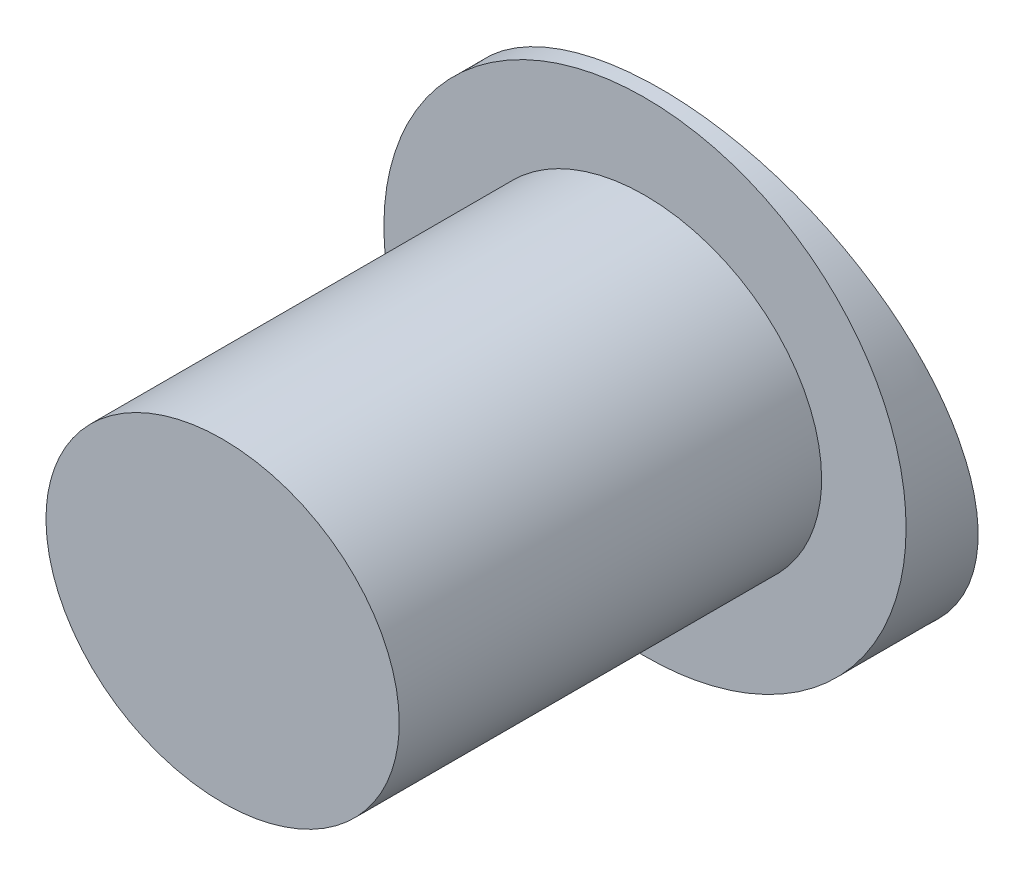
ISO-10303-21;
HEADER;
FILE_DESCRIPTION(('STEP AP214'),'2;1');
FILE_NAME('part.step','',(''),(''),'','','');
FILE_SCHEMA(('AUTOMOTIVE_DESIGN { 1 0 10303 214 1 1 1 1 }'));
ENDSEC;
DATA;
#1=APPLICATION_CONTEXT('core data for automotive mechanical design processes');
#2=APPLICATION_PROTOCOL_DEFINITION('international standard','automotive_design',2000,#1);
#3=PRODUCT_CONTEXT('',#1,'mechanical');
#4=PRODUCT('Part','Part','',(#3));
#5=PRODUCT_RELATED_PRODUCT_CATEGORY('part','',(#4));
#6=PRODUCT_DEFINITION_FORMATION('','',#4);
#7=PRODUCT_DEFINITION_CONTEXT('part definition',#1,'design');
#8=PRODUCT_DEFINITION('design','',#6,#7);
#9=PRODUCT_DEFINITION_SHAPE('','',#8);
#10=(LENGTH_UNIT() NAMED_UNIT(*) SI_UNIT(.MILLI.,.METRE.));
#11=(NAMED_UNIT(*) PLANE_ANGLE_UNIT() SI_UNIT($,.RADIAN.));
#12=(NAMED_UNIT(*) SI_UNIT($,.STERADIAN.) SOLID_ANGLE_UNIT());
#13=UNCERTAINTY_MEASURE_WITH_UNIT(LENGTH_MEASURE(1.E-05),#10,'distance_accuracy_value','');
#14=(GEOMETRIC_REPRESENTATION_CONTEXT(3) GLOBAL_UNCERTAINTY_ASSIGNED_CONTEXT((#13)) GLOBAL_UNIT_ASSIGNED_CONTEXT((#10,
#11,#12)) REPRESENTATION_CONTEXT('',''));
#15=CARTESIAN_POINT('',(0.,0.,0.));
#16=DIRECTION('',(0.,0.,1.));
#17=DIRECTION('',(1.,0.,0.));
#18=AXIS2_PLACEMENT_3D('',#15,#16,#17);
#19=CARTESIAN_POINT('',(-6.8,0.,-14.));
#20=CARTESIAN_POINT('',(-6.8,0.433288327017882,-14.));
#21=CARTESIAN_POINT('',(-6.75241623918822,0.858366789318417,-14.));
#22=CARTESIAN_POINT('',(-6.56669350048157,1.6928997685016,-14.));
#23=CARTESIAN_POINT('',(-6.42593496589087,2.10646432470144,-14.));
#24=CARTESIAN_POINT('',(-6.06502077946472,2.88351596537641,-14.));
#25=CARTESIAN_POINT('',(-5.84513782173978,3.25023430353571,-14.));
#26=CARTESIAN_POINT('',(-5.4571812493302,3.76815739814183,-14.));
#27=CARTESIAN_POINT('',(-5.31849415232598,3.93466075191506,-14.));
#28=CARTESIAN_POINT('',(-5.0278802522335,4.25012524863653,-14.));
#29=CARTESIAN_POINT('',(-4.87530875171523,4.3999724438203,-14.));
#30=CARTESIAN_POINT('',(-4.55609558279421,4.68439486073192,-14.));
#31=CARTESIAN_POINT('',(-4.38945272316332,4.81896878948268,-14.));
#32=CARTESIAN_POINT('',(-4.04214202784557,5.07289372542383,-14.));
#33=CARTESIAN_POINT('',(-3.86090614551277,5.19247257704731,-14.));
#34=CARTESIAN_POINT('',(-3.30684778903162,5.52179462881207,-14.));
#35=CARTESIAN_POINT('',(-2.92075333708403,5.70488509614901,-14.));
#36=CARTESIAN_POINT('',(-2.11655938182206,6.00128900909616,-14.));
#37=CARTESIAN_POINT('',(-1.69610545760056,6.11431758800332,-14.));
#38=CARTESIAN_POINT('',(-0.85378878137073,6.26286530020241,-14.));
#39=CARTESIAN_POINT('',(-0.428447412867185,6.3000640003056,-14.));
#40=CARTESIAN_POINT('',(0.215870939078355,6.29996787697511,-14.));
#41=CARTESIAN_POINT('',(0.432632938983341,6.29042124328013,-14.));
#42=CARTESIAN_POINT('',(0.860837611376539,6.25262645739517,-14.));
#43=CARTESIAN_POINT('',(1.07288822927773,6.2244614538175,-14.));
#44=CARTESIAN_POINT('',(1.70298577834547,6.11261915171547,-14.));
#45=CARTESIAN_POINT('',(2.11503534731815,6.00185177080731,-14.));
#46=CARTESIAN_POINT('',(2.72048972370927,5.778696268597,-14.));
#47=CARTESIAN_POINT('',(2.92051732246431,5.6944630532301,-14.));
#48=CARTESIAN_POINT('',(3.30781838286319,5.50998341043302,-14.));
#49=CARTESIAN_POINT('',(3.49615939508585,5.40939521227842,-14.));
#50=CARTESIAN_POINT('',(4.04528311200834,5.08263145367567,-14.));
#51=CARTESIAN_POINT('',(4.39033491286368,4.83172153644008,-14.));
#52=CARTESIAN_POINT('',(4.87370990843407,4.40157831863281,-14.));
#53=CARTESIAN_POINT('',(5.02819913131833,4.24978318078785,-14.));
#54=CARTESIAN_POINT('',(5.31828795393822,3.93488050207727,-14.));
#55=CARTESIAN_POINT('',(5.45475436297693,3.77102456416908,-14.));
#56=CARTESIAN_POINT('',(5.71043152424103,3.43042908781699,-14.));
#57=CARTESIAN_POINT('',(5.82964407047417,3.25369088883413,-14.));
#58=CARTESIAN_POINT('',(6.05019793151896,2.8868712835245,-14.));
#59=CARTESIAN_POINT('',(6.15201457180541,2.69574531034534,-14.));
#60=CARTESIAN_POINT('',(6.42542698783263,2.10848454295557,-14.));
#61=CARTESIAN_POINT('',(6.56323947653883,1.70430351885267,-14.));
#62=CARTESIAN_POINT('',(6.75054699096156,0.870766929490032,-14.));
#63=CARTESIAN_POINT('',(6.79942714302823,0.436118566493674,-14.));
#64=CARTESIAN_POINT('',(6.8005625739134,-0.420600760281517,-14.));
#65=CARTESIAN_POINT('',(6.75460282525542,-0.84551306791546,-14.));
#66=CARTESIAN_POINT('',(6.61492546890545,-1.4776403640284,-14.));
#67=CARTESIAN_POINT('',(6.55649149478053,-1.6866872355737,-14.));
#68=CARTESIAN_POINT('',(6.41890410892055,-2.09309330337095,-14.));
#69=CARTESIAN_POINT('',(6.33950068365258,-2.29168874715316,-14.));
#70=CARTESIAN_POINT('',(6.15998500574276,-2.67988621383843,-14.));
#71=CARTESIAN_POINT('',(6.05987169187281,-2.86948777587181,-14.));
#72=CARTESIAN_POINT('',(5.83880643557088,-3.23964110905378,-14.));
#73=CARTESIAN_POINT('',(5.71776697213712,-3.42002033458585,-14.));
#74=CARTESIAN_POINT('',(5.33192858517686,-3.93587106894263,-14.));
#75=CARTESIAN_POINT('',(5.04223304418031,-4.2505798636767,-14.));
#76=CARTESIAN_POINT('',(4.56082110802009,-4.68050641553838,-14.));
#77=CARTESIAN_POINT('',(4.39180697761757,-4.81712595576104,-14.));
#78=CARTESIAN_POINT('',(4.04471446373682,-5.07113285599945,-14.));
#79=CARTESIAN_POINT('',(3.86600227698754,-5.18918260619546,-14.));
#80=CARTESIAN_POINT('',(3.31495355542297,-5.51748578016713,-14.));
#81=CARTESIAN_POINT('',(2.92615744732289,-5.70272731244022,-14.));
#82=CARTESIAN_POINT('',(2.11596657067965,-6.001672496799,-14.));
#83=CARTESIAN_POINT('',(1.70277845589563,-6.11271604455791,-14.));
#84=CARTESIAN_POINT('',(1.07149752877712,-6.22467814975525,-14.));
#85=CARTESIAN_POINT('',(0.85914021123725,-6.25283239185984,-14.));
#86=CARTESIAN_POINT('',(0.430510973620271,-6.29055191659552,-14.));
#87=CARTESIAN_POINT('',(0.213656009927172,-6.30003370890853,-14.));
#88=CARTESIAN_POINT('',(-0.430786666576888,-6.29993230882312,-14.));
#89=CARTESIAN_POINT('',(-0.855993728490451,-6.2625888695087,-14.));
#90=CARTESIAN_POINT('',(-1.69763442786098,-6.11393501959793,-14.));
#91=CARTESIAN_POINT('',(-2.11819205564536,-6.00080011354235,-14.));
#92=CARTESIAN_POINT('',(-2.92243337786917,-5.70415254981059,-14.));
#93=CARTESIAN_POINT('',(-3.30741860912684,-5.52133596513065,-14.));
#94=CARTESIAN_POINT('',(-4.04218653979238,-5.08484177856928,-14.));
#95=CARTESIAN_POINT('',(-4.39508149266217,-4.82773210424261,-14.));
#96=CARTESIAN_POINT('',(-5.03412848528504,-4.25858995690001,-14.));
#97=CARTESIAN_POINT('',(-5.3233109425649,-3.9457601736987,-14.));
#98=CARTESIAN_POINT('',(-5.70934689492623,-3.43205404374183,-14.));
#99=CARTESIAN_POINT('',(-5.83064218602389,-3.25227206968252,-14.));
#100=CARTESIAN_POINT('',(-6.05289313591445,-2.88214342621327,-14.));
#101=CARTESIAN_POINT('',(-6.15342465819993,-2.69278869910542,-14.));
#102=CARTESIAN_POINT('',(-6.42370337627923,-2.11204202899084,-14.));
#103=CARTESIAN_POINT('',(-6.56247831461694,-1.70810674696064,-14.));
#104=CARTESIAN_POINT('',(-6.7518553552028,-0.864527394888873,-14.));
#105=CARTESIAN_POINT('',(-6.8,-0.43328832701788,-14.));
#106=CARTESIAN_POINT('',(-6.8,0.,-14.));
#107=B_SPLINE_CURVE_WITH_KNOTS('',3,(#19,#20,#21,#22,#23,#24,#25,#26,#27,#28,#29,#30,#31,#32,
#33,#34,#35,#36,#37,#38,#39,#40,#41,#42,#43,#44,#45,#46,#47,#48,#49,#50,#51,#52,#53,#54,#55,#56,
#57,#58,#59,#60,#61,#62,#63,#64,#65,#66,#67,#68,#69,#70,#71,#72,#73,#74,#75,#76,#77,#78,#79,#80,
#81,#82,#83,#84,#85,#86,#87,#88,#89,#90,#91,#92,#93,#94,#95,#96,#97,#98,#99,#100,#101,#102,#103,
#104,#105,#106),.UNSPECIFIED.,.T.,.F.,(4,2,2,2,2,2,2,2,2,2,2,2,2,2,2,2,2,2,2,2,2,2,2,2,2,2,2,2,
2,2,2,2,2,2,2,2,2,2,2,2,2,2,2,4),(0.,0.0312500000000001,0.0625000000000002,0.0937500000000004,
0.109375,0.125000000000001,0.140625000000001,0.156250000000001,0.187500000000001,
0.218750000000001,0.250000000000001,0.265625000000001,0.281250000000001,0.312500000000001,
0.328125000000001,0.343750000000001,0.375000000000001,0.390625000000001,0.406250000000001,
0.421875000000001,0.437500000000001,0.468750000000001,0.500000000000001,0.531250000000001,
0.546875000000001,0.562500000000001,0.578125000000001,0.593750000000001,0.625000000000001,
0.640625000000001,0.656250000000001,0.687500000000001,0.718750000000001,0.734375000000001,
0.750000000000001,0.781250000000001,0.812500000000001,0.84375,0.875,0.90625,0.921875,0.9375,
0.96875,1.),.UNSPECIFIED.);
#108=DIRECTION('',(0.,0.,1.));
#109=VECTOR('',#108,1.);
#110=SURFACE_OF_LINEAR_EXTRUSION('',#107,#109);
#111=CARTESIAN_POINT('',(-6.8,0.,-11.));
#112=CARTESIAN_POINT('',(-6.8,0.433288327017882,-11.));
#113=CARTESIAN_POINT('',(-6.75241623918822,0.858366789318417,-11.));
#114=CARTESIAN_POINT('',(-6.56669350048157,1.6928997685016,-11.));
#115=CARTESIAN_POINT('',(-6.42593496589087,2.10646432470144,-11.));
#116=CARTESIAN_POINT('',(-6.06502077946472,2.88351596537641,-11.));
#117=CARTESIAN_POINT('',(-5.84513782173978,3.25023430353571,-11.));
#118=CARTESIAN_POINT('',(-5.4571812493302,3.76815739814183,-11.));
#119=CARTESIAN_POINT('',(-5.31849415232598,3.93466075191506,-11.));
#120=CARTESIAN_POINT('',(-5.0278802522335,4.25012524863653,-11.));
#121=CARTESIAN_POINT('',(-4.87530875171523,4.3999724438203,-11.));
#122=CARTESIAN_POINT('',(-4.55609558279421,4.68439486073192,-11.));
#123=CARTESIAN_POINT('',(-4.38945272316332,4.81896878948268,-11.));
#124=CARTESIAN_POINT('',(-4.04214202784557,5.07289372542383,-11.));
#125=CARTESIAN_POINT('',(-3.86090614551277,5.19247257704731,-11.));
#126=CARTESIAN_POINT('',(-3.30684778903162,5.52179462881207,-11.));
#127=CARTESIAN_POINT('',(-2.92075333708403,5.70488509614901,-11.));
#128=CARTESIAN_POINT('',(-2.11655938182206,6.00128900909616,-11.));
#129=CARTESIAN_POINT('',(-1.69610545760056,6.11431758800332,-11.));
#130=CARTESIAN_POINT('',(-0.85378878137073,6.26286530020241,-11.));
#131=CARTESIAN_POINT('',(-0.428447412867185,6.3000640003056,-11.));
#132=CARTESIAN_POINT('',(0.215870939078355,6.29996787697511,-11.));
#133=CARTESIAN_POINT('',(0.432632938983341,6.29042124328013,-11.));
#134=CARTESIAN_POINT('',(0.860837611376539,6.25262645739517,-11.));
#135=CARTESIAN_POINT('',(1.07288822927773,6.2244614538175,-11.));
#136=CARTESIAN_POINT('',(1.70298577834547,6.11261915171547,-11.));
#137=CARTESIAN_POINT('',(2.11503534731815,6.00185177080731,-11.));
#138=CARTESIAN_POINT('',(2.72048972370927,5.778696268597,-11.));
#139=CARTESIAN_POINT('',(2.92051732246431,5.6944630532301,-11.));
#140=CARTESIAN_POINT('',(3.30781838286319,5.50998341043302,-11.));
#141=CARTESIAN_POINT('',(3.49615939508585,5.40939521227842,-11.));
#142=CARTESIAN_POINT('',(4.04528311200834,5.08263145367567,-11.));
#143=CARTESIAN_POINT('',(4.39033491286368,4.83172153644008,-11.));
#144=CARTESIAN_POINT('',(4.87370990843407,4.40157831863281,-11.));
#145=CARTESIAN_POINT('',(5.02819913131833,4.24978318078785,-11.));
#146=CARTESIAN_POINT('',(5.31828795393822,3.93488050207727,-11.));
#147=CARTESIAN_POINT('',(5.45475436297693,3.77102456416908,-11.));
#148=CARTESIAN_POINT('',(5.71043152424103,3.43042908781699,-11.));
#149=CARTESIAN_POINT('',(5.82964407047417,3.25369088883413,-11.));
#150=CARTESIAN_POINT('',(6.05019793151896,2.8868712835245,-11.));
#151=CARTESIAN_POINT('',(6.15201457180541,2.69574531034534,-11.));
#152=CARTESIAN_POINT('',(6.42542698783263,2.10848454295557,-11.));
#153=CARTESIAN_POINT('',(6.56323947653883,1.70430351885267,-11.));
#154=CARTESIAN_POINT('',(6.75054699096156,0.870766929490032,-11.));
#155=CARTESIAN_POINT('',(6.79942714302823,0.436118566493674,-11.));
#156=CARTESIAN_POINT('',(6.8005625739134,-0.420600760281517,-11.));
#157=CARTESIAN_POINT('',(6.75460282525542,-0.84551306791546,-11.));
#158=CARTESIAN_POINT('',(6.61492546890545,-1.4776403640284,-11.));
#159=CARTESIAN_POINT('',(6.55649149478053,-1.6866872355737,-11.));
#160=CARTESIAN_POINT('',(6.41890410892055,-2.09309330337095,-11.));
#161=CARTESIAN_POINT('',(6.33950068365258,-2.29168874715316,-11.));
#162=CARTESIAN_POINT('',(6.15998500574276,-2.67988621383843,-11.));
#163=CARTESIAN_POINT('',(6.05987169187281,-2.86948777587181,-11.));
#164=CARTESIAN_POINT('',(5.83880643557088,-3.23964110905378,-11.));
#165=CARTESIAN_POINT('',(5.71776697213712,-3.42002033458585,-11.));
#166=CARTESIAN_POINT('',(5.33192858517686,-3.93587106894263,-11.));
#167=CARTESIAN_POINT('',(5.04223304418031,-4.2505798636767,-11.));
#168=CARTESIAN_POINT('',(4.56082110802009,-4.68050641553838,-11.));
#169=CARTESIAN_POINT('',(4.39180697761757,-4.81712595576104,-11.));
#170=CARTESIAN_POINT('',(4.04471446373682,-5.07113285599945,-11.));
#171=CARTESIAN_POINT('',(3.86600227698754,-5.18918260619546,-11.));
#172=CARTESIAN_POINT('',(3.31495355542297,-5.51748578016713,-11.));
#173=CARTESIAN_POINT('',(2.92615744732289,-5.70272731244022,-11.));
#174=CARTESIAN_POINT('',(2.11596657067965,-6.001672496799,-11.));
#175=CARTESIAN_POINT('',(1.70277845589563,-6.11271604455791,-11.));
#176=CARTESIAN_POINT('',(1.07149752877712,-6.22467814975525,-11.));
#177=CARTESIAN_POINT('',(0.85914021123725,-6.25283239185984,-11.));
#178=CARTESIAN_POINT('',(0.430510973620271,-6.29055191659552,-11.));
#179=CARTESIAN_POINT('',(0.213656009927172,-6.30003370890853,-11.));
#180=CARTESIAN_POINT('',(-0.430786666576888,-6.29993230882312,-11.));
#181=CARTESIAN_POINT('',(-0.855993728490451,-6.2625888695087,-11.));
#182=CARTESIAN_POINT('',(-1.69763442786098,-6.11393501959793,-11.));
#183=CARTESIAN_POINT('',(-2.11819205564536,-6.00080011354235,-11.));
#184=CARTESIAN_POINT('',(-2.92243337786917,-5.70415254981059,-11.));
#185=CARTESIAN_POINT('',(-3.30741860912684,-5.52133596513065,-11.));
#186=CARTESIAN_POINT('',(-4.04218653979238,-5.08484177856928,-11.));
#187=CARTESIAN_POINT('',(-4.39508149266217,-4.82773210424261,-11.));
#188=CARTESIAN_POINT('',(-5.03412848528504,-4.25858995690001,-11.));
#189=CARTESIAN_POINT('',(-5.3233109425649,-3.9457601736987,-11.));
#190=CARTESIAN_POINT('',(-5.70934689492623,-3.43205404374183,-11.));
#191=CARTESIAN_POINT('',(-5.83064218602389,-3.25227206968252,-11.));
#192=CARTESIAN_POINT('',(-6.05289313591445,-2.88214342621327,-11.));
#193=CARTESIAN_POINT('',(-6.15342465819993,-2.69278869910542,-11.));
#194=CARTESIAN_POINT('',(-6.42370337627923,-2.11204202899084,-11.));
#195=CARTESIAN_POINT('',(-6.56247831461694,-1.70810674696064,-11.));
#196=CARTESIAN_POINT('',(-6.7518553552028,-0.864527394888873,-11.));
#197=CARTESIAN_POINT('',(-6.8,-0.43328832701788,-11.));
#198=CARTESIAN_POINT('',(-6.8,0.,-11.));
#199=B_SPLINE_CURVE_WITH_KNOTS('',3,(#111,#112,#113,#114,#115,#116,#117,#118,#119,#120,#121,
#122,#123,#124,#125,#126,#127,#128,#129,#130,#131,#132,#133,#134,#135,#136,#137,#138,#139,#140,
#141,#142,#143,#144,#145,#146,#147,#148,#149,#150,#151,#152,#153,#154,#155,#156,#157,#158,#159,
#160,#161,#162,#163,#164,#165,#166,#167,#168,#169,#170,#171,#172,#173,#174,#175,#176,#177,#178,
#179,#180,#181,#182,#183,#184,#185,#186,#187,#188,#189,#190,#191,#192,#193,#194,#195,#196,#197,
#198),.UNSPECIFIED.,.T.,.F.,(4,2,2,2,2,2,2,2,2,2,2,2,2,2,2,2,2,2,2,2,2,2,2,2,2,2,2,2,2,2,2,2,2,
2,2,2,2,2,2,2,2,2,2,4),(0.,0.0312500000000001,0.0625000000000002,0.0937500000000004,0.109375,
0.125000000000001,0.140625000000001,0.156250000000001,0.187500000000001,0.218750000000001,
0.250000000000001,0.265625000000001,0.281250000000001,0.312500000000001,0.328125000000001,
0.343750000000001,0.375000000000001,0.390625000000001,0.406250000000001,0.421875000000001,
0.437500000000001,0.468750000000001,0.500000000000001,0.531250000000001,0.546875000000001,
0.562500000000001,0.578125000000001,0.593750000000001,0.625000000000001,0.640625000000001,
0.656250000000001,0.687500000000001,0.718750000000001,0.734375000000001,0.750000000000001,
0.781250000000001,0.812500000000001,0.84375,0.875,0.90625,0.921875,0.9375,0.96875,1.),.UNSPECIFIED.);
#200=CARTESIAN_POINT('',(-6.8,0.,-11.));
#201=VERTEX_POINT('',#200);
#202=EDGE_CURVE('E57',#201,#201,#199,.T.);
#203=ORIENTED_EDGE('',*,*,#202,.T.);
#204=EDGE_LOOP('',(#203));
#205=FACE_BOUND('',#204,.T.);
#206=CARTESIAN_POINT('',(-2.3873752607165,-5.89999994250763,-14.0000000012654));
#207=CARTESIAN_POINT('',(-2.47774638015375,-5.86868134178153,-13.9933430280147));
#208=CARTESIAN_POINT('',(-2.56745661207357,-5.83557762325859,-13.9863066157805));
#209=CARTESIAN_POINT('',(-2.74541787763631,-5.7658033351185,-13.9714756332667));
#210=CARTESIAN_POINT('',(-2.83366887146091,-5.72913266835713,-13.9636810423384));
#211=CARTESIAN_POINT('',(-3.09600404147713,-5.61378483081386,-13.9391631024569));
#212=CARTESIAN_POINT('',(-3.2676864434427,-5.52976628055353,-13.9213044083718));
#213=CARTESIAN_POINT('',(-3.51947898608946,-5.39343089518521,-13.8923254276491));
#214=CARTESIAN_POINT('',(-3.60253194062796,-5.3462173428045,-13.8822898772847));
#215=CARTESIAN_POINT('',(-3.76652449640334,-5.24838302961578,-13.8614945520555));
#216=CARTESIAN_POINT('',(-3.84746409322194,-5.19776226168528,-13.8507347756767));
#217=CARTESIAN_POINT('',(-4.00707060134692,-5.09321351204058,-13.8285122529265));
#218=CARTESIAN_POINT('',(-4.08573761587256,-5.03928568087962,-13.8170495385562));
#219=CARTESIAN_POINT('',(-4.24068353058721,-4.92824119291222,-13.7934463040011));
#220=CARTESIAN_POINT('',(-4.31696241915868,-4.87112452059677,-13.7813057805198));
#221=CARTESIAN_POINT('',(-4.46710851817397,-4.7536584412872,-13.756337594589));
#222=CARTESIAN_POINT('',(-4.54097101581737,-4.69330326028595,-13.7435087048364));
#223=CARTESIAN_POINT('',(-4.68591105898354,-4.56948561183482,-13.7171904512075));
#224=CARTESIAN_POINT('',(-4.75698863154973,-4.50602317457184,-13.7037010937477));
#225=CARTESIAN_POINT('',(-4.96588248187863,-4.31118893309568,-13.662287797284));
#226=CARTESIAN_POINT('',(-5.09939527478606,-4.1753425130999,-13.6334127493345));
#227=CARTESIAN_POINT('',(-5.35339103940702,-3.89272719342179,-13.5733410087084));
#228=CARTESIAN_POINT('',(-5.47388717450396,-3.74596958642629,-13.5421467163665));
#229=CARTESIAN_POINT('',(-5.70101524459525,-3.44252268098653,-13.4776470854969));
#230=CARTESIAN_POINT('',(-5.80764750139925,-3.28583361319791,-13.4443417959964));
#231=CARTESIAN_POINT('',(-6.00146560846411,-2.97090390046827,-13.3774014190909));
#232=CARTESIAN_POINT('',(-6.08931281956154,-2.8130538892144,-13.3438493634392));
#233=CARTESIAN_POINT('',(-6.21021015341839,-2.5711334307341,-13.292427582587));
#234=CARTESIAN_POINT('',(-6.24870016629899,-2.48962769421496,-13.2751030034761));
#235=CARTESIAN_POINT('',(-6.32200568078608,-2.32505343586325,-13.2401216649815));
#236=CARTESIAN_POINT('',(-6.35682118636996,-2.24198491572239,-13.2224649059573));
#237=CARTESIAN_POINT('',(-6.45556557427915,-1.99060653447635,-13.1690327815615));
#238=CARTESIAN_POINT('',(-6.51380366309576,-1.82010122198815,-13.1327907585925));
#239=CARTESIAN_POINT('',(-6.58928417260289,-1.56111644066268,-13.0777418439491));
#240=CARTESIAN_POINT('',(-6.61246686448107,-1.47424032216937,-13.0592757549109));
#241=CARTESIAN_POINT('',(-6.65487241887096,-1.29956585647937,-13.0221475510723));
#242=CARTESIAN_POINT('',(-6.67409530609434,-1.21176751504153,-13.003485437496));
#243=CARTESIAN_POINT('',(-6.72416928582837,-0.955080530015592,-12.9489249345334));
#244=CARTESIAN_POINT('',(-6.74966672532694,-0.78516229547869,-12.9128076988352));
#245=CARTESIAN_POINT('',(-6.78566022467699,-0.443836420363276,-12.8402566444117));
#246=CARTESIAN_POINT('',(-6.7961566301657,-0.272428814192774,-12.803822833));
#247=CARTESIAN_POINT('',(-6.80210242538437,0.0705999735145619,-12.7309098133311));
#248=CARTESIAN_POINT('',(-6.7975549647795,0.242221102826423,-12.6944306161746));
#249=CARTESIAN_POINT('',(-6.77337570753745,0.584461917029063,-12.6216850854446));
#250=CARTESIAN_POINT('',(-6.75374443369761,0.755081636421689,-12.5854187445374));
#251=CARTESIAN_POINT('',(-6.7133691157403,1.00767539931994,-12.5317282827964));
#252=CARTESIAN_POINT('',(-6.69828153819609,1.09054973174426,-12.5141127996456));
#253=CARTESIAN_POINT('',(-6.66458385468472,1.2556103375874,-12.4790280848004));
#254=CARTESIAN_POINT('',(-6.6459738198151,1.33779662485881,-12.4615588501616));
#255=CARTESIAN_POINT('',(-6.58483169772046,1.58308131904874,-12.4094219789343));
#256=CARTESIAN_POINT('',(-6.53698275584738,1.74493592172115,-12.3750187210998));
#257=CARTESIAN_POINT('',(-6.42794140899022,2.0642869909487,-12.3071385558591));
#258=CARTESIAN_POINT('',(-6.36674866684058,2.22178334726817,-12.2736616718843));
#259=CARTESIAN_POINT('',(-6.26505383113279,2.45382682201302,-12.2243393087346));
#260=CARTESIAN_POINT('',(-6.22950342130436,2.53047663756603,-12.208046887488));
#261=CARTESIAN_POINT('',(-6.15522273882052,2.68230883983035,-12.1757739566239));
#262=CARTESIAN_POINT('',(-6.11649169488431,2.75749086510997,-12.1597935238311));
#263=CARTESIAN_POINT('',(-5.99447216791866,2.98269641418871,-12.1119246066499));
#264=CARTESIAN_POINT('',(-5.90630109409616,3.13022377617985,-12.0805666978328));
#265=CARTESIAN_POINT('',(-5.7178699422489,3.41766963774869,-12.0194681938314));
#266=CARTESIAN_POINT('',(-5.61760935975767,3.55758781945966,-11.9897276662118));
#267=CARTESIAN_POINT('',(-5.40584605601733,3.82905658897081,-11.9320251979638));
#268=CARTESIAN_POINT('',(-5.2943422692718,3.96060638178494,-11.9040634263148));
#269=CARTESIAN_POINT('',(-5.06091281421522,4.21452960290356,-11.8500903795056));
#270=CARTESIAN_POINT('',(-4.93898716864687,4.33690305123167,-11.8240791000893));
#271=CARTESIAN_POINT('',(-4.68100055614459,4.57613686040515,-11.7732283841762));
#272=CARTESIAN_POINT('',(-4.54458584145387,4.69263228725227,-11.7484665167953));
#273=CARTESIAN_POINT('',(-4.26255337280986,4.91442961712766,-11.7013220389694));
#274=CARTESIAN_POINT('',(-4.11693522043298,5.01973103502907,-11.6789395316413));
#275=CARTESIAN_POINT('',(-3.81757885806217,5.21866938846427,-11.6366538792508));
#276=CARTESIAN_POINT('',(-3.66383947770185,5.31230463619679,-11.6167510929416));
#277=CARTESIAN_POINT('',(-3.34927771966236,5.48745273968923,-11.5795222142803));
#278=CARTESIAN_POINT('',(-3.18845505753726,5.56896510804992,-11.5621962255279));
#279=CARTESIAN_POINT('',(-2.93840578431689,5.68375772346633,-11.5377963018899));
#280=CARTESIAN_POINT('',(-2.85133797781188,5.72159964315222,-11.5297527535545));
#281=CARTESIAN_POINT('',(-2.67572319200033,5.79378386715385,-11.5144095230939));
#282=CARTESIAN_POINT('',(-2.58717657212874,5.82812700786621,-11.5071096631871));
#283=CARTESIAN_POINT('',(-2.31947078542274,5.92580105442325,-11.4863484036866));
#284=CARTESIAN_POINT('',(-2.13824201793045,5.98377827103108,-11.4740249658692));
#285=CARTESIAN_POINT('',(-1.77161358521277,6.08547000416128,-11.4524097207248));
#286=CARTESIAN_POINT('',(-1.58621306093699,6.12918155382084,-11.4431185440239));
#287=CARTESIAN_POINT('',(-1.30590983460604,6.18369279163191,-11.4315318227424));
#288=CARTESIAN_POINT('',(-1.212103636601,6.2000210597252,-11.4280611422184));
#289=CARTESIAN_POINT('',(-1.02388820939814,6.22902736736032,-11.4218956612008));
#290=CARTESIAN_POINT('',(-0.929478879406226,6.24170477955407,-11.419200994054));
#291=CARTESIAN_POINT('',(-0.637012274021211,6.27515694154144,-11.4120905175215));
#292=CARTESIAN_POINT('',(-0.438170419653812,6.28969117438429,-11.409001170962));
#293=CARTESIAN_POINT('',(-0.0399263931909483,6.30258985843306,-11.4062594710305));
#294=CARTESIAN_POINT('',(0.159475891563196,6.3009507853302,-11.4066078667735));
#295=CARTESIAN_POINT('',(0.557521830194672,6.28153500852297,-11.4107348175338));
#296=CARTESIAN_POINT('',(0.756165261263166,6.26375388372074,-11.4145143122844));
#297=CARTESIAN_POINT('',(1.1511564964783,6.21208281233533,-11.4254973375559));
#298=CARTESIAN_POINT('',(1.34750530870393,6.17820023473629,-11.4326993017509));
#299=CARTESIAN_POINT('',(1.73952864962504,6.09388434252902,-11.4506211978926));
#300=CARTESIAN_POINT('',(1.93514958904935,6.04321206082532,-11.4613919238635));
#301=CARTESIAN_POINT('',(2.32122584861655,5.92561550903274,-11.4863878425768));
#302=CARTESIAN_POINT('',(2.51168100925528,5.85869073774808,-11.5006131418516));
#303=CARTESIAN_POINT('',(2.88599145245675,5.70905167872585,-11.5324199057289));
#304=CARTESIAN_POINT('',(3.06984705431654,5.62633815609955,-11.550001207702));
#305=CARTESIAN_POINT('',(3.42942678346115,5.44546041707776,-11.5884479579911));
#306=CARTESIAN_POINT('',(3.60515120850756,5.34729676704229,-11.6093132859236));
#307=CARTESIAN_POINT('',(3.94283690099302,5.13877305847059,-11.6536363684443));
#308=CARTESIAN_POINT('',(4.10503140755627,5.02877581286491,-11.6770170047634));
#309=CARTESIAN_POINT('',(4.3403481943141,4.85362994934459,-11.714245407304));
#310=CARTESIAN_POINT('',(4.41746054313894,4.79355402842124,-11.7270149384946));
#311=CARTESIAN_POINT('',(4.56892218479086,4.67011170963758,-11.7532534133399));
#312=CARTESIAN_POINT('',(4.64327058037479,4.60674425900005,-11.7667225807692));
#313=CARTESIAN_POINT('',(4.86182694031375,4.41193819052577,-11.8081298888765));
#314=CARTESIAN_POINT('',(5.00164334390547,4.27572349155203,-11.8370832169393));
#315=CARTESIAN_POINT('',(5.2680978035524,3.99151728160735,-11.8974931117304));
#316=CARTESIAN_POINT('',(5.39473694365369,3.84352674116299,-11.928949472167));
#317=CARTESIAN_POINT('',(5.62748818963518,3.54472951766012,-11.9924607826313));
#318=CARTESIAN_POINT('',(5.73432174673728,3.39446082692197,-12.0244013788612));
#319=CARTESIAN_POINT('',(5.9340186826415,3.08534982916085,-12.0901049497197));
#320=CARTESIAN_POINT('',(6.02688593220766,2.92650991429846,-12.1238674158788));
#321=CARTESIAN_POINT('',(6.19780455203428,2.60147699399108,-12.1929552958489));
#322=CARTESIAN_POINT('',(6.27586573424439,2.43528894883017,-12.228279655319));
#323=CARTESIAN_POINT('',(6.38133365993861,2.18134291632899,-12.2822575508372));
#324=CARTESIAN_POINT('',(6.41456992061177,2.09586054170048,-12.3004273904716));
#325=CARTESIAN_POINT('',(6.47704736226219,1.92350289917308,-12.3370631383448));
#326=CARTESIAN_POINT('',(6.50628856476152,1.83662763878071,-12.355529044988));
#327=CARTESIAN_POINT('',(6.55930299444384,1.66613297733936,-12.391768804007));
#328=CARTESIAN_POINT('',(6.58327920858109,1.58257388904271,-12.4095298365117));
#329=CARTESIAN_POINT('',(6.62755199336698,1.41453726632364,-12.4452471232715));
#330=CARTESIAN_POINT('',(6.64784864725209,1.33005975272302,-12.4632033731008));
#331=CARTESIAN_POINT('',(6.7030482660272,1.07535281944642,-12.5173430030716));
#332=CARTESIAN_POINT('',(6.73224715814721,0.903892972013217,-12.5537879187065));
#333=CARTESIAN_POINT('',(6.76471889024558,0.645436363453258,-12.6087245667629));
#334=CARTESIAN_POINT('',(6.77365514937885,0.559069933791598,-12.6270823180955));
#335=CARTESIAN_POINT('',(6.78773261710702,0.386039539043894,-12.6638610638675));
#336=CARTESIAN_POINT('',(6.79287389849411,0.299375579696857,-12.682282057087));
#337=CARTESIAN_POINT('',(6.80245155942593,0.0392718692740916,-12.7375688074521));
#338=CARTESIAN_POINT('',(6.80105790061969,-0.134406793263701,-12.7744853467965));
#339=CARTESIAN_POINT('',(6.78309471127932,-0.476553978674783,-12.8472109761126));
#340=CARTESIAN_POINT('',(6.76691195461855,-0.645042691864243,-12.8830243576684));
#341=CARTESIAN_POINT('',(6.72001145205423,-0.979914322502742,-12.9542035200777));
#342=CARTESIAN_POINT('',(6.68930765238045,-1.14629910351066,-12.989569697043));
#343=CARTESIAN_POINT('',(6.61375619761058,-1.47602003743531,-13.0596540450686));
#344=CARTESIAN_POINT('',(6.56890383493417,-1.63935515646677,-13.0943719963699));
#345=CARTESIAN_POINT('',(6.46538148664909,-1.96182015166201,-13.1629140470075));
#346=CARTESIAN_POINT('',(6.40670842607167,-2.12094908321488,-13.1967379455606));
#347=CARTESIAN_POINT('',(6.27598223914094,-2.43408940000992,-13.2632979746189));
#348=CARTESIAN_POINT('',(6.20391230790423,-2.58809406818141,-13.2960326773665));
#349=CARTESIAN_POINT('',(6.04704052461605,-2.88977363635164,-13.3601566491029));
#350=CARTESIAN_POINT('',(5.96223810654939,-3.03744825457638,-13.3915458581987));
#351=CARTESIAN_POINT('',(5.78061150559187,-3.32555224362837,-13.452784251515));
#352=CARTESIAN_POINT('',(5.68378658433875,-3.46598116871076,-13.4826333409895));
#353=CARTESIAN_POINT('',(5.4789197138755,-3.73877492388326,-13.540617443634));
#354=CARTESIAN_POINT('',(5.37087772606459,-3.87113972622019,-13.5687524509049));
#355=CARTESIAN_POINT('',(5.14059691759531,-4.13117541407954,-13.6240247426278));
#356=CARTESIAN_POINT('',(5.01800904935589,-4.25855063604006,-13.6510991818497));
#357=CARTESIAN_POINT('',(4.76267383178159,-4.50315071936781,-13.703090534546));
#358=CARTESIAN_POINT('',(4.62992598743867,-4.62037508557753,-13.7280073427715));
#359=CARTESIAN_POINT('',(4.3552867478329,-4.84408018927946,-13.7755573304424));
#360=CARTESIAN_POINT('',(4.21339554922133,-4.9505611577097,-13.7981905589752));
#361=CARTESIAN_POINT('',(3.92148848828231,-5.15215906052742,-13.841041516038));
#362=CARTESIAN_POINT('',(3.7714744958603,-5.24727859434269,-13.8612597970935));
#363=CARTESIAN_POINT('',(3.42267333693531,-5.44997559434277,-13.9043443744743));
#364=CARTESIAN_POINT('',(3.22167707785316,-5.55395399562864,-13.9264456659396));
#365=CARTESIAN_POINT('',(2.91343888680127,-5.69498802835706,-13.9564233750148));
#366=CARTESIAN_POINT('',(2.8096746621927,-5.73947385139409,-13.9658791286026));
#367=CARTESIAN_POINT('',(2.60007378559935,-5.82347404964396,-13.9837339219222));
#368=CARTESIAN_POINT('',(2.49423730993445,-5.86298884571631,-13.9921330511104));
#369=CARTESIAN_POINT('',(2.387472836772,-5.89999993033191,-14.));
#370=B_SPLINE_CURVE_WITH_KNOTS('',3,(#206,#207,#208,#209,#210,#211,#212,#213,#214,#215,#216,
#217,#218,#219,#220,#221,#222,#223,#224,#225,#226,#227,#228,#229,#230,#231,#232,#233,#234,#235,
#236,#237,#238,#239,#240,#241,#242,#243,#244,#245,#246,#247,#248,#249,#250,#251,#252,#253,#254,
#255,#256,#257,#258,#259,#260,#261,#262,#263,#264,#265,#266,#267,#268,#269,#270,#271,#272,#273,
#274,#275,#276,#277,#278,#279,#280,#281,#282,#283,#284,#285,#286,#287,#288,#289,#290,#291,#292,
#293,#294,#295,#296,#297,#298,#299,#300,#301,#302,#303,#304,#305,#306,#307,#308,#309,#310,#311,
#312,#313,#314,#315,#316,#317,#318,#319,#320,#321,#322,#323,#324,#325,#326,#327,#328,#329,#330,
#331,#332,#333,#334,#335,#336,#337,#338,#339,#340,#341,#342,#343,#344,#345,#346,#347,#348,#349,
#350,#351,#352,#353,#354,#355,#356,#357,#358,#359,#360,#361,#362,#363,#364,#365,#366,#367,#368,
#369),.UNSPECIFIED.,.F.,.F.,(4,2,2,2,2,2,2,2,2,2,2,2,2,2,2,2,2,2,2,2,2,2,2,2,2,2,2,2,2,2,2,2,2,
2,2,2,2,2,2,2,2,2,2,2,2,2,2,2,2,2,2,2,2,2,2,2,2,2,2,2,2,2,2,2,2,2,2,2,2,2,2,2,2,2,2,2,2,2,2,2,2,
4),(0.,0.287578779886475,0.575165394045139,1.15028774612782,1.43840490500219,1.72652266617884,
2.01462732058766,2.30273337632347,2.59137137273322,2.88000656558843,3.45714147475569,
4.03368716921007,4.61021947844097,5.16067857736353,5.43596058303844,5.71124229073737,
6.26172867398452,6.537034443718,6.81233849531962,7.33836768336334,7.86438475102843,
8.39029169588487,8.91618041389416,9.17429267218527,9.43239972127567,9.94851988501068,
10.4646530913653,10.7227347006732,10.9808790787612,11.5043377851419,12.0278183417737,
12.55134855434,13.0748776244822,13.6175399315782,14.1602257470372,14.7029899845332,
15.2457760379184,15.5315345212316,15.8172245317876,16.3885924166999,16.9600790546634,
17.2458507747373,17.5316715713877,18.1291040440472,18.7266667054884,19.3243930809585,
19.9218461642901,20.5281968155415,21.1345661678651,21.7409061434325,22.3472238973858,
22.9385061282965,23.2341681246872,23.5299252762854,24.1210742611987,24.712174575897,
25.2728183980282,25.8333065501568,26.3934219601876,26.6738398833449,26.9542562957823,
27.2203515314701,27.4864407469844,28.0187597048052,28.2849380753537,28.551111340152,
29.0830664879416,29.6014957539293,30.119428120588,30.6375329983738,31.1557532584389,
31.6746280093,32.1935258332663,32.7124555411298,33.2313870348211,33.7673123025161,
34.3032636978711,34.8392035700613,35.3750205866016,36.0558998943823,36.3956690223799,
36.7354093652916),.UNSPECIFIED.);
#371=CARTESIAN_POINT('',(-2.38741171368523,-5.89999993033191,-14.));
#372=VERTEX_POINT('',#371);
#373=CARTESIAN_POINT('',(2.38748360522887,-5.89999993587993,-14.));
#374=VERTEX_POINT('',#373);
#375=EDGE_CURVE('E48',#372,#374,#370,.T.);
#376=ORIENTED_EDGE('',*,*,#375,.F.);
#377=CARTESIAN_POINT('',(-2.38740781461546,-5.89998867062103,-14.));
#378=CARTESIAN_POINT('',(-2.02597009903046,-6.02514154862116,-14.));
#379=CARTESIAN_POINT('',(-1.65149622410487,-6.12208412838205,-14.));
#380=CARTESIAN_POINT('',(-0.855993728490451,-6.2625888695087,-14.));
#381=CARTESIAN_POINT('',(-0.430786666576888,-6.29993230882312,-14.));
#382=CARTESIAN_POINT('',(0.213656009927172,-6.30003370890853,-14.));
#383=CARTESIAN_POINT('',(0.430510973620271,-6.29055191659552,-14.));
#384=CARTESIAN_POINT('',(0.85914021123725,-6.25283239185984,-14.));
#385=CARTESIAN_POINT('',(1.07149752877712,-6.22467814975525,-14.));
#386=CARTESIAN_POINT('',(1.65662075856941,-6.12090243629208,-14.));
#387=CARTESIAN_POINT('',(2.02524048548729,-6.02559230678238,-14.));
#388=CARTESIAN_POINT('',(2.38748244792112,-5.89999659798379,-14.));
#389=B_SPLINE_CURVE_WITH_KNOTS('',3,(#377,#378,#379,#380,#381,#382,#383,#384,#385,#386,#387,
#388),.UNSPECIFIED.,.F.,.F.,(4,2,2,2,2,4),(0.690927383862274,0.718751173916731,
0.750001173916731,0.765626173916731,0.781251173916731,0.809073790054458),.UNSPECIFIED.);
#390=EDGE_CURVE('E55',#374,#372,#389,.F.);
#391=ORIENTED_EDGE('',*,*,#390,.F.);
#392=EDGE_LOOP('',(#376,#391));
#393=FACE_BOUND('',#392,.T.);
#394=ADVANCED_FACE('F33',(#205,#393),#110,.F.);
#395=CARTESIAN_POINT('',(6.79999485847081,0.00775890310613776,-14.));
#396=DIRECTION('',(0.,0.,1.));
#397=DIRECTION('',(1.,0.,0.));
#398=AXIS2_PLACEMENT_3D('',#395,#396,#397);
#399=PLANE('',#398);
#400=DIRECTION('',(-1.,0.,0.));
#401=VECTOR('',#400,1.);
#402=CARTESIAN_POINT('',(6.79999485847081,-5.89999993033191,-14.));
#403=LINE('',#402,#401);
#404=EDGE_CURVE('E11',#374,#372,#403,.T.);
#405=ORIENTED_EDGE('',*,*,#404,.F.);
#406=ORIENTED_EDGE('',*,*,#390,.T.);
#407=EDGE_LOOP('',(#405,#406));
#408=FACE_BOUND('',#407,.T.);
#409=ADVANCED_FACE('F60',(#408),#399,.F.);
#410=CARTESIAN_POINT('',(0.,0.,-11.));
#411=DIRECTION('',(0.,0.,1.));
#412=DIRECTION('',(1.,0.,0.));
#413=AXIS2_PLACEMENT_3D('',#410,#411,#412);
#414=ELLIPSE('',#413,4.6,4.1);
#415=DIRECTION('',(0.,0.,1.));
#416=VECTOR('',#415,1.);
#417=SURFACE_OF_LINEAR_EXTRUSION('',#414,#416);
#418=CARTESIAN_POINT('',(0.,0.,-11.));
#419=DIRECTION('',(0.,0.,1.));
#420=DIRECTION('',(1.,0.,0.));
#421=AXIS2_PLACEMENT_3D('',#418,#419,#420);
#422=ELLIPSE('',#421,4.6,4.1);
#423=CARTESIAN_POINT('',(4.6,0.,-11.));
#424=VERTEX_POINT('',#423);
#425=EDGE_CURVE('E61',#424,#424,#422,.F.);
#426=ORIENTED_EDGE('',*,*,#425,.F.);
#427=EDGE_LOOP('',(#426));
#428=FACE_BOUND('',#427,.T.);
#429=CARTESIAN_POINT('',(0.,0.,0.));
#430=DIRECTION('',(0.,0.,1.));
#431=DIRECTION('',(1.,0.,0.));
#432=AXIS2_PLACEMENT_3D('',#429,#430,#431);
#433=ELLIPSE('',#432,4.6,4.1);
#434=CARTESIAN_POINT('',(4.6,0.,0.));
#435=VERTEX_POINT('',#434);
#436=EDGE_CURVE('E43',#435,#435,#433,.T.);
#437=ORIENTED_EDGE('',*,*,#436,.F.);
#438=EDGE_LOOP('',(#437));
#439=FACE_BOUND('',#438,.T.);
#440=ADVANCED_FACE('F35',(#428,#439),#417,.T.);
#441=CARTESIAN_POINT('',(0.,0.,0.));
#442=DIRECTION('',(0.,0.,1.));
#443=DIRECTION('',(1.,0.,0.));
#444=AXIS2_PLACEMENT_3D('',#441,#442,#443);
#445=PLANE('',#444);
#446=ORIENTED_EDGE('',*,*,#436,.T.);
#447=EDGE_LOOP('',(#446));
#448=FACE_BOUND('',#447,.T.);
#449=ADVANCED_FACE('F89',(#448),#445,.T.);
#450=CARTESIAN_POINT('',(6.79999485847081,0.00775890310613776,-11.));
#451=DIRECTION('',(0.,0.,1.));
#452=DIRECTION('',(1.,0.,0.));
#453=AXIS2_PLACEMENT_3D('',#450,#451,#452);
#454=PLANE('',#453);
#455=ORIENTED_EDGE('',*,*,#425,.T.);
#456=EDGE_LOOP('',(#455));
#457=FACE_BOUND('',#456,.T.);
#458=ORIENTED_EDGE('',*,*,#202,.F.);
#459=EDGE_LOOP('',(#458));
#460=FACE_BOUND('',#459,.T.);
#461=ADVANCED_FACE('F86',(#457,#460),#454,.T.);
#462=CARTESIAN_POINT('',(6.81045165207895,6.30000000073886,-11.4068099622772));
#463=DIRECTION('',(0.,0.207911690817753,-0.978147600733807));
#464=DIRECTION('',(0.,0.978147600733807,0.207911690817753));
#465=AXIS2_PLACEMENT_3D('',#462,#463,#464);
#466=PLANE('',#465);
#467=ORIENTED_EDGE('',*,*,#375,.T.);
#468=ORIENTED_EDGE('',*,*,#404,.T.);
#469=EDGE_LOOP('',(#467,#468));
#470=FACE_BOUND('',#469,.T.);
#471=ADVANCED_FACE('F50',(#470),#466,.T.);
#472=CLOSED_SHELL('',(#394,#409,#440,#449,#461,#471));
#473=MANIFOLD_SOLID_BREP('B2',#472);
#474=ADVANCED_BREP_SHAPE_REPRESENTATION('',(#18,#473),#14);
#475=SHAPE_DEFINITION_REPRESENTATION(#9,#474);
ENDSEC;
END-ISO-10303-21;
